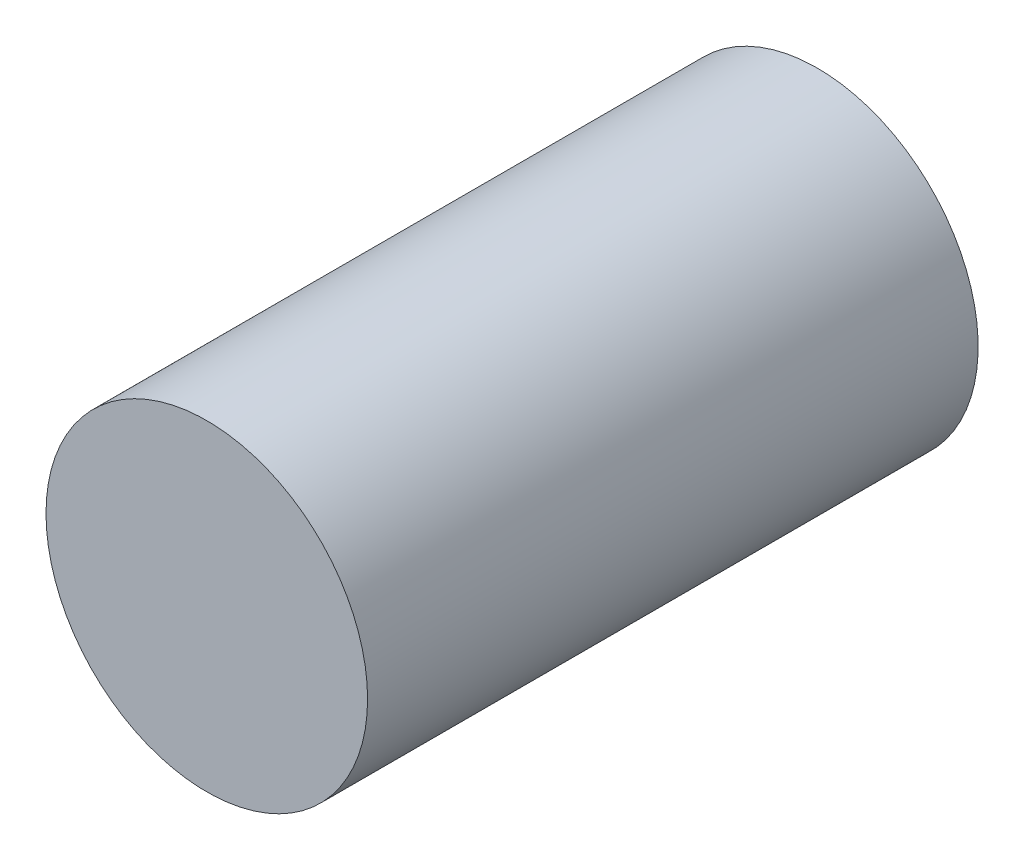
ISO-10303-21;
HEADER;
FILE_DESCRIPTION(('STEP AP214'),'2;1');
FILE_NAME('part.step','',(''),(''),'','','');
FILE_SCHEMA(('AUTOMOTIVE_DESIGN { 1 0 10303 214 1 1 1 1 }'));
ENDSEC;
DATA;
#1=APPLICATION_CONTEXT('core data for automotive mechanical design processes');
#2=APPLICATION_PROTOCOL_DEFINITION('international standard','automotive_design',2000,#1);
#3=PRODUCT_CONTEXT('',#1,'mechanical');
#4=PRODUCT('Part','Part','',(#3));
#5=PRODUCT_RELATED_PRODUCT_CATEGORY('part','',(#4));
#6=PRODUCT_DEFINITION_FORMATION('','',#4);
#7=PRODUCT_DEFINITION_CONTEXT('part definition',#1,'design');
#8=PRODUCT_DEFINITION('design','',#6,#7);
#9=PRODUCT_DEFINITION_SHAPE('','',#8);
#10=(LENGTH_UNIT() NAMED_UNIT(*) SI_UNIT(.MILLI.,.METRE.));
#11=(NAMED_UNIT(*) PLANE_ANGLE_UNIT() SI_UNIT($,.RADIAN.));
#12=(NAMED_UNIT(*) SI_UNIT($,.STERADIAN.) SOLID_ANGLE_UNIT());
#13=UNCERTAINTY_MEASURE_WITH_UNIT(LENGTH_MEASURE(1.E-05),#10,'distance_accuracy_value','');
#14=(GEOMETRIC_REPRESENTATION_CONTEXT(3) GLOBAL_UNCERTAINTY_ASSIGNED_CONTEXT((#13)) GLOBAL_UNIT_ASSIGNED_CONTEXT((#10,
#11,#12)) REPRESENTATION_CONTEXT('',''));
#15=CARTESIAN_POINT('',(0.,0.,0.));
#16=DIRECTION('',(0.,0.,1.));
#17=DIRECTION('',(1.,0.,0.));
#18=AXIS2_PLACEMENT_3D('',#15,#16,#17);
#19=CARTESIAN_POINT('',(76.2,0.,-149.225));
#20=DIRECTION('',(0.,0.,-1.));
#21=DIRECTION('',(-1.,0.,0.));
#22=AXIS2_PLACEMENT_3D('',#19,#20,#21);
#23=PLANE('',#22);
#24=CARTESIAN_POINT('',(0.,0.,-149.225));
#25=DIRECTION('',(0.,0.,-1.));
#26=DIRECTION('',(-1.,0.,0.));
#27=AXIS2_PLACEMENT_3D('',#24,#25,#26);
#28=CIRCLE('',#27,82.55);
#29=CARTESIAN_POINT('',(-82.55,0.,-149.225));
#30=VERTEX_POINT('',#29);
#31=EDGE_CURVE('E10',#30,#30,#28,.T.);
#32=ORIENTED_EDGE('',*,*,#31,.T.);
#33=EDGE_LOOP('',(#32));
#34=FACE_BOUND('',#33,.T.);
#35=CARTESIAN_POINT('',(0.,0.,-149.225));
#36=DIRECTION('',(0.,0.,-1.));
#37=DIRECTION('',(-1.,0.,0.));
#38=AXIS2_PLACEMENT_3D('',#35,#36,#37);
#39=CIRCLE('',#38,76.2);
#40=CARTESIAN_POINT('',(-76.2,0.,-149.225));
#41=VERTEX_POINT('',#40);
#42=EDGE_CURVE('E45',#41,#41,#39,.T.);
#43=ORIENTED_EDGE('',*,*,#42,.F.);
#44=EDGE_LOOP('',(#43));
#45=FACE_BOUND('',#44,.T.);
#46=ADVANCED_FACE('F35',(#34,#45),#23,.T.);
#47=CARTESIAN_POINT('',(0.,0.,149.225));
#48=DIRECTION('',(0.,0.,-1.));
#49=DIRECTION('',(-1.,0.,0.));
#50=AXIS2_PLACEMENT_3D('',#47,#48,#49);
#51=CYLINDRICAL_SURFACE('',#50,82.55);
#52=ORIENTED_EDGE('',*,*,#31,.F.);
#53=EDGE_LOOP('',(#52));
#54=FACE_BOUND('',#53,.T.);
#55=CARTESIAN_POINT('',(0.,0.,164.225));
#56=DIRECTION('',(0.,0.,1.));
#57=DIRECTION('',(1.,0.,0.));
#58=AXIS2_PLACEMENT_3D('',#55,#56,#57);
#59=CIRCLE('',#58,82.55);
#60=CARTESIAN_POINT('',(82.55,0.,164.225));
#61=VERTEX_POINT('',#60);
#62=EDGE_CURVE('E49',#61,#61,#59,.T.);
#63=ORIENTED_EDGE('',*,*,#62,.F.);
#64=EDGE_LOOP('',(#63));
#65=FACE_BOUND('',#64,.T.);
#66=ADVANCED_FACE('F57',(#54,#65),#51,.T.);
#67=CARTESIAN_POINT('',(0.,0.,149.225));
#68=DIRECTION('',(0.,0.,-1.));
#69=DIRECTION('',(-1.,0.,0.));
#70=AXIS2_PLACEMENT_3D('',#67,#68,#69);
#71=CYLINDRICAL_SURFACE('',#70,76.2);
#72=ORIENTED_EDGE('',*,*,#42,.T.);
#73=EDGE_LOOP('',(#72));
#74=FACE_BOUND('',#73,.T.);
#75=CARTESIAN_POINT('',(0.,0.,149.225));
#76=DIRECTION('',(0.,0.,-1.));
#77=DIRECTION('',(-1.,0.,0.));
#78=AXIS2_PLACEMENT_3D('',#75,#76,#77);
#79=CIRCLE('',#78,76.2);
#80=CARTESIAN_POINT('',(-76.2,0.,149.225));
#81=VERTEX_POINT('',#80);
#82=EDGE_CURVE('E41',#81,#81,#79,.T.);
#83=ORIENTED_EDGE('',*,*,#82,.F.);
#84=EDGE_LOOP('',(#83));
#85=FACE_BOUND('',#84,.T.);
#86=ADVANCED_FACE('F59',(#74,#85),#71,.F.);
#87=CARTESIAN_POINT('',(0.,0.,149.225));
#88=DIRECTION('',(0.,0.,1.));
#89=DIRECTION('',(1.,0.,0.));
#90=AXIS2_PLACEMENT_3D('',#87,#88,#89);
#91=PLANE('',#90);
#92=ORIENTED_EDGE('',*,*,#82,.T.);
#93=EDGE_LOOP('',(#92));
#94=FACE_BOUND('',#93,.T.);
#95=ADVANCED_FACE('F65',(#94),#91,.F.);
#96=CARTESIAN_POINT('',(0.,0.,164.225));
#97=DIRECTION('',(0.,0.,1.));
#98=DIRECTION('',(1.,0.,0.));
#99=AXIS2_PLACEMENT_3D('',#96,#97,#98);
#100=PLANE('',#99);
#101=ORIENTED_EDGE('',*,*,#62,.T.);
#102=EDGE_LOOP('',(#101));
#103=FACE_BOUND('',#102,.T.);
#104=ADVANCED_FACE('F55',(#103),#100,.T.);
#105=CLOSED_SHELL('',(#46,#66,#86,#95,#104));
#106=MANIFOLD_SOLID_BREP('B2',#105);
#107=ADVANCED_BREP_SHAPE_REPRESENTATION('',(#18,#106),#14);
#108=SHAPE_DEFINITION_REPRESENTATION(#9,#107);
ENDSEC;
END-ISO-10303-21;
